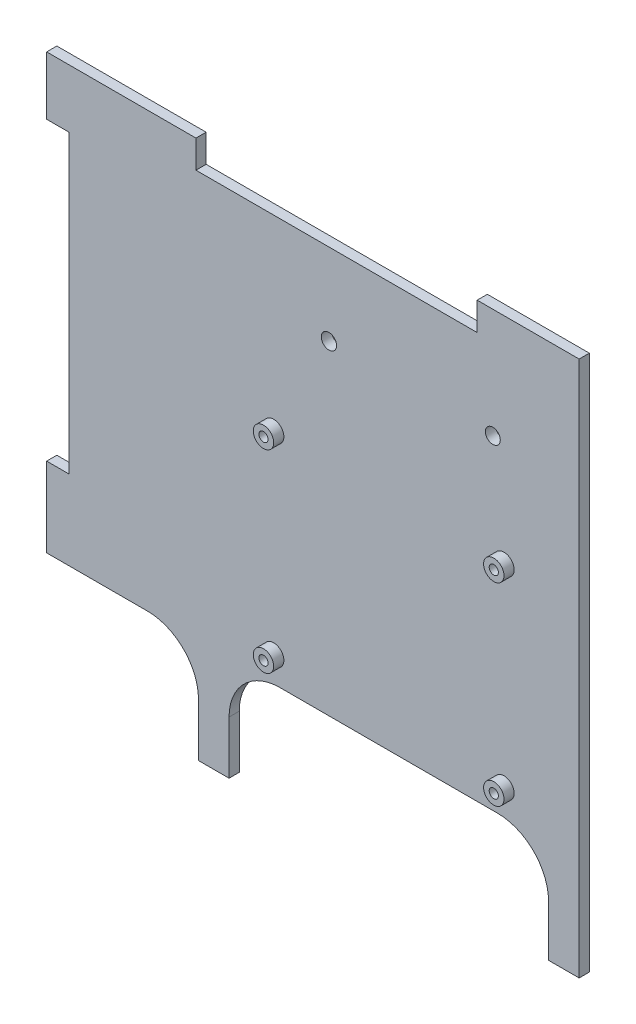
ISO-10303-21;
HEADER;
FILE_DESCRIPTION(('STEP AP214'),'2;1');
FILE_NAME('part.step','',(''),(''),'','','');
FILE_SCHEMA(('AUTOMOTIVE_DESIGN { 1 0 10303 214 1 1 1 1 }'));
ENDSEC;
DATA;
#1=APPLICATION_CONTEXT('core data for automotive mechanical design processes');
#2=APPLICATION_PROTOCOL_DEFINITION('international standard','automotive_design',2000,#1);
#3=PRODUCT_CONTEXT('',#1,'mechanical');
#4=PRODUCT('Part','Part','',(#3));
#5=PRODUCT_RELATED_PRODUCT_CATEGORY('part','',(#4));
#6=PRODUCT_DEFINITION_FORMATION('','',#4);
#7=PRODUCT_DEFINITION_CONTEXT('part definition',#1,'design');
#8=PRODUCT_DEFINITION('design','',#6,#7);
#9=PRODUCT_DEFINITION_SHAPE('','',#8);
#10=(LENGTH_UNIT() NAMED_UNIT(*) SI_UNIT(.MILLI.,.METRE.));
#11=(NAMED_UNIT(*) PLANE_ANGLE_UNIT() SI_UNIT($,.RADIAN.));
#12=(NAMED_UNIT(*) SI_UNIT($,.STERADIAN.) SOLID_ANGLE_UNIT());
#13=UNCERTAINTY_MEASURE_WITH_UNIT(LENGTH_MEASURE(1.E-05),#10,'distance_accuracy_value','');
#14=(GEOMETRIC_REPRESENTATION_CONTEXT(3) GLOBAL_UNCERTAINTY_ASSIGNED_CONTEXT((#13)) GLOBAL_UNIT_ASSIGNED_CONTEXT((#10,
#11,#12)) REPRESENTATION_CONTEXT('',''));
#15=CARTESIAN_POINT('',(0.,0.,0.));
#16=DIRECTION('',(0.,0.,1.));
#17=DIRECTION('',(1.,0.,0.));
#18=AXIS2_PLACEMENT_3D('',#15,#16,#17);
#19=CARTESIAN_POINT('',(12.708274755667,-91.0589998065809,2.54));
#20=DIRECTION('',(0.,1.,0.));
#21=DIRECTION('',(0.,0.,1.));
#22=AXIS2_PLACEMENT_3D('',#19,#20,#21);
#23=PLANE('',#22);
#24=DIRECTION('',(1.,0.,0.));
#25=VECTOR('',#24,1.);
#26=CARTESIAN_POINT('',(12.708274755667,-91.0589998065809,0.));
#27=LINE('',#26,#25);
#28=CARTESIAN_POINT('',(5.088274755667,-91.0589998065809,0.));
#29=VERTEX_POINT('',#28);
#30=CARTESIAN_POINT('',(12.708274755667,-91.0589998065809,0.));
#31=VERTEX_POINT('',#30);
#32=EDGE_CURVE('E213',#29,#31,#27,.T.);
#33=ORIENTED_EDGE('',*,*,#32,.T.);
#34=DIRECTION('',(0.,0.,-1.));
#35=VECTOR('',#34,1.);
#36=CARTESIAN_POINT('',(12.708274755667,-91.0589998065809,2.54));
#37=LINE('',#36,#35);
#38=CARTESIAN_POINT('',(12.708274755667,-91.0589998065809,2.54));
#39=VERTEX_POINT('',#38);
#40=EDGE_CURVE('E11',#39,#31,#37,.T.);
#41=ORIENTED_EDGE('',*,*,#40,.F.);
#42=DIRECTION('',(1.,0.,0.));
#43=VECTOR('',#42,1.);
#44=CARTESIAN_POINT('',(12.708274755667,-91.0589998065809,2.54));
#45=LINE('',#44,#43);
#46=CARTESIAN_POINT('',(5.088274755667,-91.0589998065809,2.54));
#47=VERTEX_POINT('',#46);
#48=EDGE_CURVE('E256',#47,#39,#45,.T.);
#49=ORIENTED_EDGE('',*,*,#48,.F.);
#50=DIRECTION('',(0.,0.,-1.));
#51=VECTOR('',#50,1.);
#52=CARTESIAN_POINT('',(5.088274755667,-91.0589998065809,2.54));
#53=LINE('',#52,#51);
#54=EDGE_CURVE('E209',#47,#29,#53,.T.);
#55=ORIENTED_EDGE('',*,*,#54,.T.);
#56=EDGE_LOOP('',(#33,#41,#49,#55));
#57=FACE_BOUND('',#56,.T.);
#58=ADVANCED_FACE('F39',(#57),#23,.F.);
#59=CARTESIAN_POINT('',(12.708274755667,42.5458464087125,2.54));
#60=DIRECTION('',(-1.,0.,0.));
#61=DIRECTION('',(0.,-1.,0.));
#62=AXIS2_PLACEMENT_3D('',#59,#60,#61);
#63=PLANE('',#62);
#64=DIRECTION('',(0.,1.,0.));
#65=VECTOR('',#64,1.);
#66=CARTESIAN_POINT('',(12.708274755667,42.5458464087125,0.));
#67=LINE('',#66,#65);
#68=CARTESIAN_POINT('',(12.708274755667,42.5458464087125,0.));
#69=VERTEX_POINT('',#68);
#70=EDGE_CURVE('E216',#31,#69,#67,.T.);
#71=ORIENTED_EDGE('',*,*,#70,.T.);
#72=DIRECTION('',(0.,0.,-1.));
#73=VECTOR('',#72,1.);
#74=CARTESIAN_POINT('',(12.708274755667,42.5458464087125,2.54));
#75=LINE('',#74,#73);
#76=CARTESIAN_POINT('',(12.708274755667,42.5458464087125,2.54));
#77=VERTEX_POINT('',#76);
#78=EDGE_CURVE('E47',#77,#69,#75,.T.);
#79=ORIENTED_EDGE('',*,*,#78,.F.);
#80=DIRECTION('',(0.,1.,0.));
#81=VECTOR('',#80,1.);
#82=CARTESIAN_POINT('',(12.708274755667,-33.1469998065807,2.54));
#83=LINE('',#82,#81);
#84=EDGE_CURVE('E137',#39,#77,#83,.T.);
#85=ORIENTED_EDGE('',*,*,#84,.F.);
#86=ORIENTED_EDGE('',*,*,#40,.T.);
#87=EDGE_LOOP('',(#71,#79,#85,#86));
#88=FACE_BOUND('',#87,.T.);
#89=ADVANCED_FACE('F379',(#88),#63,.F.);
#90=CARTESIAN_POINT('',(12.708274755667,42.5458464087125,2.54));
#91=DIRECTION('',(6.65955359009881E-05,-0.999999997782517,0.));
#92=DIRECTION('',(0.999999997782517,6.65955359009881E-05,0.));
#93=AXIS2_PLACEMENT_3D('',#90,#91,#92);
#94=PLANE('',#93);
#95=DIRECTION('',(-0.999999997782517,-6.65955359009881E-05,0.));
#96=VECTOR('',#95,1.);
#97=CARTESIAN_POINT('',(12.708274755667,42.5458464087125,0.));
#98=LINE('',#97,#96);
#99=CARTESIAN_POINT('',(-12.7139378821143,42.5441534028343,0.));
#100=VERTEX_POINT('',#99);
#101=EDGE_CURVE('E219',#69,#100,#98,.T.);
#102=ORIENTED_EDGE('',*,*,#101,.T.);
#103=DIRECTION('',(0.,0.,-1.));
#104=VECTOR('',#103,1.);
#105=CARTESIAN_POINT('',(-12.7139378821143,42.5441534028343,2.54));
#106=LINE('',#105,#104);
#107=CARTESIAN_POINT('',(-12.7139378821143,42.5441534028343,2.54));
#108=VERTEX_POINT('',#107);
#109=EDGE_CURVE('E302',#108,#100,#106,.T.);
#110=ORIENTED_EDGE('',*,*,#109,.F.);
#111=DIRECTION('',(-0.999999997782517,-6.65955359009881E-05,0.));
#112=VECTOR('',#111,1.);
#113=CARTESIAN_POINT('',(12.708274755667,42.5458464087125,2.54));
#114=LINE('',#113,#112);
#115=EDGE_CURVE('E310',#77,#108,#114,.T.);
#116=ORIENTED_EDGE('',*,*,#115,.F.);
#117=ORIENTED_EDGE('',*,*,#78,.T.);
#118=EDGE_LOOP('',(#102,#110,#116,#117));
#119=FACE_BOUND('',#118,.T.);
#120=ADVANCED_FACE('F308',(#119),#94,.F.);
#121=CARTESIAN_POINT('',(-12.7139378821143,42.5441534028343,2.54));
#122=DIRECTION('',(0.999999672458744,0.000809371611161022,0.));
#123=DIRECTION('',(-0.000809371611161022,0.999999672458744,0.));
#124=AXIS2_PLACEMENT_3D('',#121,#122,#123);
#125=PLANE('',#124);
#126=DIRECTION('',(0.000809371611161022,-0.999999672458744,0.));
#127=VECTOR('',#126,1.);
#128=CARTESIAN_POINT('',(-12.7139378821143,42.5441534028343,0.));
#129=LINE('',#128,#127);
#130=CARTESIAN_POINT('',(-12.7082789284205,35.5523689589811,0.));
#131=VERTEX_POINT('',#130);
#132=EDGE_CURVE('E221',#100,#131,#129,.T.);
#133=ORIENTED_EDGE('',*,*,#132,.T.);
#134=DIRECTION('',(0.,0.,-1.));
#135=VECTOR('',#134,1.);
#136=CARTESIAN_POINT('',(-12.7082789284205,35.5523689589811,2.54));
#137=LINE('',#136,#135);
#138=CARTESIAN_POINT('',(-12.7082789284205,35.5523689589811,2.54));
#139=VERTEX_POINT('',#138);
#140=EDGE_CURVE('E299',#139,#131,#137,.T.);
#141=ORIENTED_EDGE('',*,*,#140,.F.);
#142=DIRECTION('',(0.000809371611161022,-0.999999672458744,0.));
#143=VECTOR('',#142,1.);
#144=CARTESIAN_POINT('',(-12.7139378821143,42.5441534028343,2.54));
#145=LINE('',#144,#143);
#146=EDGE_CURVE('E328',#108,#139,#145,.T.);
#147=ORIENTED_EDGE('',*,*,#146,.F.);
#148=ORIENTED_EDGE('',*,*,#109,.T.);
#149=EDGE_LOOP('',(#133,#141,#147,#148));
#150=FACE_BOUND('',#149,.T.);
#151=ADVANCED_FACE('F319',(#150),#125,.F.);
#152=CARTESIAN_POINT('',(-82.8011936971982,35.5523689589811,2.54));
#153=DIRECTION('',(0.,-1.,0.));
#154=DIRECTION('',(1.,0.,0.));
#155=AXIS2_PLACEMENT_3D('',#152,#153,#154);
#156=PLANE('',#155);
#157=DIRECTION('',(-1.,0.,0.));
#158=VECTOR('',#157,1.);
#159=CARTESIAN_POINT('',(-82.8011936971982,35.5523689589811,0.));
#160=LINE('',#159,#158);
#161=CARTESIAN_POINT('',(-82.8011936971982,35.5523689589811,0.));
#162=VERTEX_POINT('',#161);
#163=EDGE_CURVE('E223',#131,#162,#160,.T.);
#164=ORIENTED_EDGE('',*,*,#163,.T.);
#165=DIRECTION('',(0.,0.,-1.));
#166=VECTOR('',#165,1.);
#167=CARTESIAN_POINT('',(-82.8011936971982,35.5523689589811,2.54));
#168=LINE('',#167,#166);
#169=CARTESIAN_POINT('',(-82.8011936971982,35.5523689589811,2.54));
#170=VERTEX_POINT('',#169);
#171=EDGE_CURVE('E296',#170,#162,#168,.T.);
#172=ORIENTED_EDGE('',*,*,#171,.F.);
#173=DIRECTION('',(-1.,0.,0.));
#174=VECTOR('',#173,1.);
#175=CARTESIAN_POINT('',(-82.8011936971982,35.5523689589811,2.54));
#176=LINE('',#175,#174);
#177=EDGE_CURVE('E325',#139,#170,#176,.T.);
#178=ORIENTED_EDGE('',*,*,#177,.F.);
#179=ORIENTED_EDGE('',*,*,#140,.T.);
#180=EDGE_LOOP('',(#164,#172,#178,#179));
#181=FACE_BOUND('',#180,.T.);
#182=ADVANCED_FACE('F323',(#181),#156,.F.);
#183=CARTESIAN_POINT('',(-82.8011936971982,35.5523689589811,2.54));
#184=DIRECTION('',(-0.999999671650771,-0.000810369267691798,0.));
#185=DIRECTION('',(0.000810369267691798,-0.999999671650771,0.));
#186=AXIS2_PLACEMENT_3D('',#183,#184,#185);
#187=PLANE('',#186);
#188=DIRECTION('',(-0.000810369267691798,0.999999671650771,0.));
#189=VECTOR('',#188,1.);
#190=CARTESIAN_POINT('',(-82.8011936971982,35.5523689589811,0.));
#191=LINE('',#190,#189);
#192=CARTESIAN_POINT('',(-82.8068104036919,42.4834124639083,0.));
#193=VERTEX_POINT('',#192);
#194=EDGE_CURVE('E225',#162,#193,#191,.T.);
#195=ORIENTED_EDGE('',*,*,#194,.T.);
#196=DIRECTION('',(0.,0.,-1.));
#197=VECTOR('',#196,1.);
#198=CARTESIAN_POINT('',(-82.8068104036919,42.4834124639083,2.54));
#199=LINE('',#198,#197);
#200=CARTESIAN_POINT('',(-82.8068104036919,42.4834124639083,2.54));
#201=VERTEX_POINT('',#200);
#202=EDGE_CURVE('E293',#201,#193,#199,.T.);
#203=ORIENTED_EDGE('',*,*,#202,.F.);
#204=DIRECTION('',(-0.000810369267691798,0.999999671650771,0.));
#205=VECTOR('',#204,1.);
#206=CARTESIAN_POINT('',(-82.8011936971982,35.5523689589811,2.54));
#207=LINE('',#206,#205);
#208=EDGE_CURVE('E327',#170,#201,#207,.T.);
#209=ORIENTED_EDGE('',*,*,#208,.F.);
#210=ORIENTED_EDGE('',*,*,#171,.T.);
#211=EDGE_LOOP('',(#195,#203,#209,#210));
#212=FACE_BOUND('',#211,.T.);
#213=ADVANCED_FACE('F392',(#212),#187,.F.);
#214=CARTESIAN_POINT('',(-120.015,42.4834124639083,2.54));
#215=DIRECTION('',(0.,-1.,0.));
#216=DIRECTION('',(0.,0.,-1.));
#217=AXIS2_PLACEMENT_3D('',#214,#215,#216);
#218=PLANE('',#217);
#219=DIRECTION('',(-1.,0.,0.));
#220=VECTOR('',#219,1.);
#221=CARTESIAN_POINT('',(-120.015,42.4834124639083,0.));
#222=LINE('',#221,#220);
#223=CARTESIAN_POINT('',(-120.015,42.4834124639083,0.));
#224=VERTEX_POINT('',#223);
#225=EDGE_CURVE('E227',#193,#224,#222,.T.);
#226=ORIENTED_EDGE('',*,*,#225,.T.);
#227=DIRECTION('',(0.,0.,-1.));
#228=VECTOR('',#227,1.);
#229=CARTESIAN_POINT('',(-120.015,42.4834124639083,2.54));
#230=LINE('',#229,#228);
#231=CARTESIAN_POINT('',(-120.015,42.4834124639083,2.54));
#232=VERTEX_POINT('',#231);
#233=EDGE_CURVE('E290',#232,#224,#230,.T.);
#234=ORIENTED_EDGE('',*,*,#233,.F.);
#235=DIRECTION('',(-1.,0.,0.));
#236=VECTOR('',#235,1.);
#237=CARTESIAN_POINT('',(-120.015,42.4834124639083,2.54));
#238=LINE('',#237,#236);
#239=EDGE_CURVE('E330',#201,#232,#238,.T.);
#240=ORIENTED_EDGE('',*,*,#239,.F.);
#241=ORIENTED_EDGE('',*,*,#202,.T.);
#242=EDGE_LOOP('',(#226,#234,#240,#241));
#243=FACE_BOUND('',#242,.T.);
#244=ADVANCED_FACE('F395',(#243),#218,.F.);
#245=CARTESIAN_POINT('',(-120.015,27.9323689589811,2.54));
#246=DIRECTION('',(1.,0.,0.));
#247=DIRECTION('',(0.,0.,-1.));
#248=AXIS2_PLACEMENT_3D('',#245,#246,#247);
#249=PLANE('',#248);
#250=DIRECTION('',(0.,-1.,0.));
#251=VECTOR('',#250,1.);
#252=CARTESIAN_POINT('',(-120.015,27.9323689589811,0.));
#253=LINE('',#252,#251);
#254=CARTESIAN_POINT('',(-120.015,27.9323689589811,0.));
#255=VERTEX_POINT('',#254);
#256=EDGE_CURVE('E229',#224,#255,#253,.T.);
#257=ORIENTED_EDGE('',*,*,#256,.T.);
#258=DIRECTION('',(0.,0.,-1.));
#259=VECTOR('',#258,1.);
#260=CARTESIAN_POINT('',(-120.015,27.9323689589811,2.54));
#261=LINE('',#260,#259);
#262=CARTESIAN_POINT('',(-120.015,27.9323689589811,2.54));
#263=VERTEX_POINT('',#262);
#264=EDGE_CURVE('E287',#263,#255,#261,.T.);
#265=ORIENTED_EDGE('',*,*,#264,.F.);
#266=DIRECTION('',(0.,-1.,0.));
#267=VECTOR('',#266,1.);
#268=CARTESIAN_POINT('',(-120.015,27.9323689589811,2.54));
#269=LINE('',#268,#267);
#270=EDGE_CURVE('E336',#232,#263,#269,.T.);
#271=ORIENTED_EDGE('',*,*,#270,.F.);
#272=ORIENTED_EDGE('',*,*,#233,.T.);
#273=EDGE_LOOP('',(#257,#265,#271,#272));
#274=FACE_BOUND('',#273,.T.);
#275=ADVANCED_FACE('F399',(#274),#249,.F.);
#276=CARTESIAN_POINT('',(-114.427,27.9323689589811,2.54));
#277=DIRECTION('',(0.,1.,0.));
#278=DIRECTION('',(0.,0.,1.));
#279=AXIS2_PLACEMENT_3D('',#276,#277,#278);
#280=PLANE('',#279);
#281=DIRECTION('',(1.,0.,0.));
#282=VECTOR('',#281,1.);
#283=CARTESIAN_POINT('',(-114.427,27.9323689589811,0.));
#284=LINE('',#283,#282);
#285=CARTESIAN_POINT('',(-114.427,27.9323689589811,0.));
#286=VERTEX_POINT('',#285);
#287=EDGE_CURVE('E231',#255,#286,#284,.T.);
#288=ORIENTED_EDGE('',*,*,#287,.T.);
#289=DIRECTION('',(0.,0.,-1.));
#290=VECTOR('',#289,1.);
#291=CARTESIAN_POINT('',(-114.427,27.9323689589811,2.54));
#292=LINE('',#291,#290);
#293=CARTESIAN_POINT('',(-114.427,27.9323689589811,2.54));
#294=VERTEX_POINT('',#293);
#295=EDGE_CURVE('E284',#294,#286,#292,.T.);
#296=ORIENTED_EDGE('',*,*,#295,.F.);
#297=DIRECTION('',(1.,0.,0.));
#298=VECTOR('',#297,1.);
#299=CARTESIAN_POINT('',(-114.427,27.9323689589811,2.54));
#300=LINE('',#299,#298);
#301=EDGE_CURVE('E338',#263,#294,#300,.T.);
#302=ORIENTED_EDGE('',*,*,#301,.F.);
#303=ORIENTED_EDGE('',*,*,#264,.T.);
#304=EDGE_LOOP('',(#288,#296,#302,#303));
#305=FACE_BOUND('',#304,.T.);
#306=ADVANCED_FACE('F403',(#305),#280,.F.);
#307=CARTESIAN_POINT('',(-114.427,27.9323689589811,2.54));
#308=DIRECTION('',(1.,0.,0.));
#309=DIRECTION('',(0.,0.,-1.));
#310=AXIS2_PLACEMENT_3D('',#307,#308,#309);
#311=PLANE('',#310);
#312=DIRECTION('',(0.,-1.,0.));
#313=VECTOR('',#312,1.);
#314=CARTESIAN_POINT('',(-114.427,27.9323689589811,0.));
#315=LINE('',#314,#313);
#316=CARTESIAN_POINT('',(-114.427,-45.8469998065808,0.));
#317=VERTEX_POINT('',#316);
#318=EDGE_CURVE('E233',#286,#317,#315,.T.);
#319=ORIENTED_EDGE('',*,*,#318,.T.);
#320=DIRECTION('',(0.,0.,-1.));
#321=VECTOR('',#320,1.);
#322=CARTESIAN_POINT('',(-114.427,-45.8469998065808,2.54));
#323=LINE('',#322,#321);
#324=CARTESIAN_POINT('',(-114.427,-45.8469998065808,2.54));
#325=VERTEX_POINT('',#324);
#326=EDGE_CURVE('E281',#325,#317,#323,.T.);
#327=ORIENTED_EDGE('',*,*,#326,.F.);
#328=DIRECTION('',(0.,-1.,0.));
#329=VECTOR('',#328,1.);
#330=CARTESIAN_POINT('',(-114.427,27.9323689589811,2.54));
#331=LINE('',#330,#329);
#332=EDGE_CURVE('E340',#294,#325,#331,.T.);
#333=ORIENTED_EDGE('',*,*,#332,.F.);
#334=ORIENTED_EDGE('',*,*,#295,.T.);
#335=EDGE_LOOP('',(#319,#327,#333,#334));
#336=FACE_BOUND('',#335,.T.);
#337=ADVANCED_FACE('F407',(#336),#311,.F.);
#338=CARTESIAN_POINT('',(-114.427,-45.8469998065808,2.54));
#339=DIRECTION('',(0.,-1.,0.));
#340=DIRECTION('',(0.,0.,-1.));
#341=AXIS2_PLACEMENT_3D('',#338,#339,#340);
#342=PLANE('',#341);
#343=DIRECTION('',(-1.,0.,0.));
#344=VECTOR('',#343,1.);
#345=CARTESIAN_POINT('',(-114.427,-45.8469998065808,0.));
#346=LINE('',#345,#344);
#347=CARTESIAN_POINT('',(-120.015,-45.8469998065808,0.));
#348=VERTEX_POINT('',#347);
#349=EDGE_CURVE('E235',#317,#348,#346,.T.);
#350=ORIENTED_EDGE('',*,*,#349,.T.);
#351=DIRECTION('',(0.,0.,-1.));
#352=VECTOR('',#351,1.);
#353=CARTESIAN_POINT('',(-120.015,-45.8469998065808,2.54));
#354=LINE('',#353,#352);
#355=CARTESIAN_POINT('',(-120.015,-45.8469998065808,2.54));
#356=VERTEX_POINT('',#355);
#357=EDGE_CURVE('E278',#356,#348,#354,.T.);
#358=ORIENTED_EDGE('',*,*,#357,.F.);
#359=DIRECTION('',(-1.,0.,0.));
#360=VECTOR('',#359,1.);
#361=CARTESIAN_POINT('',(-114.427,-45.8469998065808,2.54));
#362=LINE('',#361,#360);
#363=EDGE_CURVE('E342',#325,#356,#362,.T.);
#364=ORIENTED_EDGE('',*,*,#363,.F.);
#365=ORIENTED_EDGE('',*,*,#326,.T.);
#366=EDGE_LOOP('',(#350,#358,#364,#365));
#367=FACE_BOUND('',#366,.T.);
#368=ADVANCED_FACE('F411',(#367),#342,.F.);
#369=CARTESIAN_POINT('',(-120.015,-45.8469998065808,2.54));
#370=DIRECTION('',(1.,0.,0.));
#371=DIRECTION('',(0.,0.,-1.));
#372=AXIS2_PLACEMENT_3D('',#369,#370,#371);
#373=PLANE('',#372);
#374=DIRECTION('',(0.,-1.,0.));
#375=VECTOR('',#374,1.);
#376=CARTESIAN_POINT('',(-120.015,-45.8469998065808,0.));
#377=LINE('',#376,#375);
#378=CARTESIAN_POINT('',(-120.015,-65.6589998065809,0.));
#379=VERTEX_POINT('',#378);
#380=EDGE_CURVE('E237',#348,#379,#377,.T.);
#381=ORIENTED_EDGE('',*,*,#380,.T.);
#382=DIRECTION('',(0.,0.,-1.));
#383=VECTOR('',#382,1.);
#384=CARTESIAN_POINT('',(-120.015,-65.6589998065809,2.54));
#385=LINE('',#384,#383);
#386=CARTESIAN_POINT('',(-120.015,-65.6589998065809,2.54));
#387=VERTEX_POINT('',#386);
#388=EDGE_CURVE('E275',#387,#379,#385,.T.);
#389=ORIENTED_EDGE('',*,*,#388,.F.);
#390=DIRECTION('',(0.,-1.,0.));
#391=VECTOR('',#390,1.);
#392=CARTESIAN_POINT('',(-120.015,-45.8469998065808,2.54));
#393=LINE('',#392,#391);
#394=EDGE_CURVE('E344',#356,#387,#393,.T.);
#395=ORIENTED_EDGE('',*,*,#394,.F.);
#396=ORIENTED_EDGE('',*,*,#357,.T.);
#397=EDGE_LOOP('',(#381,#389,#395,#396));
#398=FACE_BOUND('',#397,.T.);
#399=ADVANCED_FACE('F415',(#398),#373,.F.);
#400=CARTESIAN_POINT('',(-120.015,-65.6589998065809,2.54));
#401=DIRECTION('',(0.,1.,0.));
#402=DIRECTION('',(0.,0.,1.));
#403=AXIS2_PLACEMENT_3D('',#400,#401,#402);
#404=PLANE('',#403);
#405=DIRECTION('',(1.,0.,0.));
#406=VECTOR('',#405,1.);
#407=CARTESIAN_POINT('',(-120.015,-65.6589998065809,0.));
#408=LINE('',#407,#406);
#409=CARTESIAN_POINT('',(-94.869,-65.6589998065809,0.));
#410=VERTEX_POINT('',#409);
#411=EDGE_CURVE('E239',#379,#410,#408,.T.);
#412=ORIENTED_EDGE('',*,*,#411,.T.);
#413=DIRECTION('',(0.,0.,-1.));
#414=VECTOR('',#413,1.);
#415=CARTESIAN_POINT('',(-94.869,-65.6589998065809,2.54));
#416=LINE('',#415,#414);
#417=CARTESIAN_POINT('',(-94.869,-65.6589998065809,2.54));
#418=VERTEX_POINT('',#417);
#419=EDGE_CURVE('E272',#418,#410,#416,.T.);
#420=ORIENTED_EDGE('',*,*,#419,.F.);
#421=DIRECTION('',(1.,0.,0.));
#422=VECTOR('',#421,1.);
#423=CARTESIAN_POINT('',(-120.015,-65.6589998065809,2.54));
#424=LINE('',#423,#422);
#425=EDGE_CURVE('E346',#387,#418,#424,.T.);
#426=ORIENTED_EDGE('',*,*,#425,.F.);
#427=ORIENTED_EDGE('',*,*,#388,.T.);
#428=EDGE_LOOP('',(#412,#420,#426,#427));
#429=FACE_BOUND('',#428,.T.);
#430=ADVANCED_FACE('F419',(#429),#404,.F.);
#431=CARTESIAN_POINT('',(-94.869,-78.3589998065809,2.54));
#432=DIRECTION('',(0.,0.,-1.));
#433=DIRECTION('',(-1.,0.,0.));
#434=AXIS2_PLACEMENT_3D('',#431,#432,#433);
#435=CYLINDRICAL_SURFACE('',#434,12.7);
#436=CARTESIAN_POINT('',(-94.869,-78.3589998065809,0.));
#437=DIRECTION('',(0.,0.,-1.));
#438=DIRECTION('',(1.,0.,0.));
#439=AXIS2_PLACEMENT_3D('',#436,#437,#438);
#440=CIRCLE('',#439,12.7);
#441=CARTESIAN_POINT('',(-82.169,-78.3589998065809,0.));
#442=VERTEX_POINT('',#441);
#443=EDGE_CURVE('E241',#410,#442,#440,.T.);
#444=ORIENTED_EDGE('',*,*,#443,.T.);
#445=DIRECTION('',(0.,0.,-1.));
#446=VECTOR('',#445,1.);
#447=CARTESIAN_POINT('',(-82.169,-78.3589998065809,2.54));
#448=LINE('',#447,#446);
#449=CARTESIAN_POINT('',(-82.169,-78.3589998065809,2.54));
#450=VERTEX_POINT('',#449);
#451=EDGE_CURVE('E269',#450,#442,#448,.T.);
#452=ORIENTED_EDGE('',*,*,#451,.F.);
#453=CARTESIAN_POINT('',(-94.869,-78.3589998065809,2.54));
#454=DIRECTION('',(0.,0.,-1.));
#455=DIRECTION('',(1.,0.,0.));
#456=AXIS2_PLACEMENT_3D('',#453,#454,#455);
#457=CIRCLE('',#456,12.7);
#458=EDGE_CURVE('E348',#418,#450,#457,.T.);
#459=ORIENTED_EDGE('',*,*,#458,.F.);
#460=ORIENTED_EDGE('',*,*,#419,.T.);
#461=EDGE_LOOP('',(#444,#452,#459,#460));
#462=FACE_BOUND('',#461,.T.);
#463=ADVANCED_FACE('F423',(#462),#435,.F.);
#464=CARTESIAN_POINT('',(-82.169,-91.5669998065809,2.54));
#465=DIRECTION('',(1.,0.,0.));
#466=DIRECTION('',(0.,0.,-1.));
#467=AXIS2_PLACEMENT_3D('',#464,#465,#466);
#468=PLANE('',#467);
#469=DIRECTION('',(0.,-1.,0.));
#470=VECTOR('',#469,1.);
#471=CARTESIAN_POINT('',(-82.169,-91.5669998065809,0.));
#472=LINE('',#471,#470);
#473=CARTESIAN_POINT('',(-82.169,-91.5669998065809,0.));
#474=VERTEX_POINT('',#473);
#475=EDGE_CURVE('E244',#442,#474,#472,.T.);
#476=ORIENTED_EDGE('',*,*,#475,.T.);
#477=DIRECTION('',(0.,0.,-1.));
#478=VECTOR('',#477,1.);
#479=CARTESIAN_POINT('',(-82.169,-91.5669998065809,2.54));
#480=LINE('',#479,#478);
#481=CARTESIAN_POINT('',(-82.169,-91.5669998065809,2.54));
#482=VERTEX_POINT('',#481);
#483=EDGE_CURVE('E266',#482,#474,#480,.T.);
#484=ORIENTED_EDGE('',*,*,#483,.F.);
#485=DIRECTION('',(0.,-1.,0.));
#486=VECTOR('',#485,1.);
#487=CARTESIAN_POINT('',(-82.169,-85.7249998065809,2.54));
#488=LINE('',#487,#486);
#489=EDGE_CURVE('E350',#450,#482,#488,.T.);
#490=ORIENTED_EDGE('',*,*,#489,.F.);
#491=ORIENTED_EDGE('',*,*,#451,.T.);
#492=EDGE_LOOP('',(#476,#484,#490,#491));
#493=FACE_BOUND('',#492,.T.);
#494=ADVANCED_FACE('F427',(#493),#468,.F.);
#495=CARTESIAN_POINT('',(-82.169,-91.5669998065809,2.54));
#496=DIRECTION('',(0.,1.,0.));
#497=DIRECTION('',(0.,0.,1.));
#498=AXIS2_PLACEMENT_3D('',#495,#496,#497);
#499=PLANE('',#498);
#500=DIRECTION('',(1.,0.,0.));
#501=VECTOR('',#500,1.);
#502=CARTESIAN_POINT('',(-82.169,-91.5669998065809,0.));
#503=LINE('',#502,#501);
#504=CARTESIAN_POINT('',(-74.549,-91.5669998065809,0.));
#505=VERTEX_POINT('',#504);
#506=EDGE_CURVE('E246',#474,#505,#503,.T.);
#507=ORIENTED_EDGE('',*,*,#506,.T.);
#508=DIRECTION('',(0.,0.,-1.));
#509=VECTOR('',#508,1.);
#510=CARTESIAN_POINT('',(-74.549,-91.5669998065809,2.54));
#511=LINE('',#510,#509);
#512=CARTESIAN_POINT('',(-74.549,-91.5669998065809,2.54));
#513=VERTEX_POINT('',#512);
#514=EDGE_CURVE('E263',#513,#505,#511,.T.);
#515=ORIENTED_EDGE('',*,*,#514,.F.);
#516=DIRECTION('',(1.,0.,0.));
#517=VECTOR('',#516,1.);
#518=CARTESIAN_POINT('',(-82.169,-91.5669998065809,2.54));
#519=LINE('',#518,#517);
#520=EDGE_CURVE('E352',#482,#513,#519,.T.);
#521=ORIENTED_EDGE('',*,*,#520,.F.);
#522=ORIENTED_EDGE('',*,*,#483,.T.);
#523=EDGE_LOOP('',(#507,#515,#521,#522));
#524=FACE_BOUND('',#523,.T.);
#525=ADVANCED_FACE('F431',(#524),#499,.F.);
#526=CARTESIAN_POINT('',(-74.549,-85.7249998065809,2.54));
#527=DIRECTION('',(-1.,0.,0.));
#528=DIRECTION('',(0.,0.,1.));
#529=AXIS2_PLACEMENT_3D('',#526,#527,#528);
#530=PLANE('',#529);
#531=DIRECTION('',(0.,1.,0.));
#532=VECTOR('',#531,1.);
#533=CARTESIAN_POINT('',(-74.549,-85.7249998065809,0.));
#534=LINE('',#533,#532);
#535=CARTESIAN_POINT('',(-74.549,-78.3589998065809,0.));
#536=VERTEX_POINT('',#535);
#537=EDGE_CURVE('E249',#505,#536,#534,.T.);
#538=ORIENTED_EDGE('',*,*,#537,.T.);
#539=DIRECTION('',(0.,0.,-1.));
#540=VECTOR('',#539,1.);
#541=CARTESIAN_POINT('',(-74.549,-78.3589998065809,2.54));
#542=LINE('',#541,#540);
#543=CARTESIAN_POINT('',(-74.549,-78.3589998065809,2.54));
#544=VERTEX_POINT('',#543);
#545=EDGE_CURVE('E260',#544,#536,#542,.T.);
#546=ORIENTED_EDGE('',*,*,#545,.F.);
#547=DIRECTION('',(0.,1.,0.));
#548=VECTOR('',#547,1.);
#549=CARTESIAN_POINT('',(-74.549,-91.5669998065809,2.54));
#550=LINE('',#549,#548);
#551=EDGE_CURVE('E354',#513,#544,#550,.T.);
#552=ORIENTED_EDGE('',*,*,#551,.F.);
#553=ORIENTED_EDGE('',*,*,#514,.T.);
#554=EDGE_LOOP('',(#538,#546,#552,#553));
#555=FACE_BOUND('',#554,.T.);
#556=ADVANCED_FACE('F360',(#555),#530,.F.);
#557=CARTESIAN_POINT('',(-61.849,-78.3589998065809,2.54));
#558=DIRECTION('',(0.,0.,-1.));
#559=DIRECTION('',(-1.,0.,0.));
#560=AXIS2_PLACEMENT_3D('',#557,#558,#559);
#561=CYLINDRICAL_SURFACE('',#560,12.7);
#562=CARTESIAN_POINT('',(-61.849,-78.3589998065809,0.));
#563=DIRECTION('',(0.,0.,-1.));
#564=DIRECTION('',(-1.,0.,0.));
#565=AXIS2_PLACEMENT_3D('',#562,#563,#564);
#566=CIRCLE('',#565,12.7);
#567=CARTESIAN_POINT('',(-61.8489999999999,-65.6589998065809,0.));
#568=VERTEX_POINT('',#567);
#569=EDGE_CURVE('E251',#536,#568,#566,.T.);
#570=ORIENTED_EDGE('',*,*,#569,.T.);
#571=DIRECTION('',(0.,0.,-1.));
#572=VECTOR('',#571,1.);
#573=CARTESIAN_POINT('',(-61.8489999999999,-65.6589998065809,2.54));
#574=LINE('',#573,#572);
#575=CARTESIAN_POINT('',(-61.8489999999999,-65.6589998065809,2.54));
#576=VERTEX_POINT('',#575);
#577=EDGE_CURVE('E204',#576,#568,#574,.T.);
#578=ORIENTED_EDGE('',*,*,#577,.F.);
#579=CARTESIAN_POINT('',(-61.849,-78.3589998065809,2.54));
#580=DIRECTION('',(0.,0.,-1.));
#581=DIRECTION('',(-1.,0.,0.));
#582=AXIS2_PLACEMENT_3D('',#579,#580,#581);
#583=CIRCLE('',#582,12.7);
#584=EDGE_CURVE('E195',#544,#576,#583,.T.);
#585=ORIENTED_EDGE('',*,*,#584,.F.);
#586=ORIENTED_EDGE('',*,*,#545,.T.);
#587=EDGE_LOOP('',(#570,#578,#585,#586));
#588=FACE_BOUND('',#587,.T.);
#589=ADVANCED_FACE('F363',(#588),#561,.F.);
#590=CARTESIAN_POINT('',(-7.611725244333,-65.6589998065809,2.54));
#591=DIRECTION('',(0.,1.,0.));
#592=DIRECTION('',(0.,0.,1.));
#593=AXIS2_PLACEMENT_3D('',#590,#591,#592);
#594=PLANE('',#593);
#595=DIRECTION('',(1.,0.,0.));
#596=VECTOR('',#595,1.);
#597=CARTESIAN_POINT('',(-7.611725244333,-65.6589998065809,0.));
#598=LINE('',#597,#596);
#599=CARTESIAN_POINT('',(-7.611725244333,-65.6589998065809,0.));
#600=VERTEX_POINT('',#599);
#601=EDGE_CURVE('E203',#568,#600,#598,.T.);
#602=ORIENTED_EDGE('',*,*,#601,.T.);
#603=DIRECTION('',(0.,0.,-1.));
#604=VECTOR('',#603,1.);
#605=CARTESIAN_POINT('',(-7.611725244333,-65.6589998065809,2.54));
#606=LINE('',#605,#604);
#607=CARTESIAN_POINT('',(-7.611725244333,-65.6589998065809,2.54));
#608=VERTEX_POINT('',#607);
#609=EDGE_CURVE('E200',#608,#600,#606,.T.);
#610=ORIENTED_EDGE('',*,*,#609,.F.);
#611=DIRECTION('',(1.,0.,0.));
#612=VECTOR('',#611,1.);
#613=CARTESIAN_POINT('',(-7.611725244333,-65.6589998065809,2.54));
#614=LINE('',#613,#612);
#615=EDGE_CURVE('E189',#576,#608,#614,.T.);
#616=ORIENTED_EDGE('',*,*,#615,.F.);
#617=ORIENTED_EDGE('',*,*,#577,.T.);
#618=EDGE_LOOP('',(#602,#610,#616,#617));
#619=FACE_BOUND('',#618,.T.);
#620=ADVANCED_FACE('F201',(#619),#594,.F.);
#621=CARTESIAN_POINT('',(-7.611725244333,-78.3589998065809,2.54));
#622=DIRECTION('',(0.,0.,-1.));
#623=DIRECTION('',(-1.,0.,0.));
#624=AXIS2_PLACEMENT_3D('',#621,#622,#623);
#625=CYLINDRICAL_SURFACE('',#624,12.7);
#626=CARTESIAN_POINT('',(-7.611725244333,-78.3589998065809,0.));
#627=DIRECTION('',(0.,0.,-1.));
#628=DIRECTION('',(1.,0.,0.));
#629=AXIS2_PLACEMENT_3D('',#626,#627,#628);
#630=CIRCLE('',#629,12.7);
#631=CARTESIAN_POINT('',(5.08827475566701,-78.3589998065809,0.));
#632=VERTEX_POINT('',#631);
#633=EDGE_CURVE('E123',#600,#632,#630,.T.);
#634=ORIENTED_EDGE('',*,*,#633,.T.);
#635=DIRECTION('',(0.,0.,-1.));
#636=VECTOR('',#635,1.);
#637=CARTESIAN_POINT('',(5.08827475566701,-78.3589998065809,2.54));
#638=LINE('',#637,#636);
#639=CARTESIAN_POINT('',(5.08827475566701,-78.3589998065809,2.54));
#640=VERTEX_POINT('',#639);
#641=EDGE_CURVE('E205',#640,#632,#638,.T.);
#642=ORIENTED_EDGE('',*,*,#641,.F.);
#643=CARTESIAN_POINT('',(-7.611725244333,-78.3589998065809,2.54));
#644=DIRECTION('',(0.,0.,-1.));
#645=DIRECTION('',(1.,0.,0.));
#646=AXIS2_PLACEMENT_3D('',#643,#644,#645);
#647=CIRCLE('',#646,12.7);
#648=EDGE_CURVE('E193',#608,#640,#647,.T.);
#649=ORIENTED_EDGE('',*,*,#648,.F.);
#650=ORIENTED_EDGE('',*,*,#609,.T.);
#651=EDGE_LOOP('',(#634,#642,#649,#650));
#652=FACE_BOUND('',#651,.T.);
#653=ADVANCED_FACE('F207',(#652),#625,.F.);
#654=CARTESIAN_POINT('',(5.088274755667,-91.0589998065809,2.54));
#655=DIRECTION('',(1.,0.,0.));
#656=DIRECTION('',(0.,0.,-1.));
#657=AXIS2_PLACEMENT_3D('',#654,#655,#656);
#658=PLANE('',#657);
#659=DIRECTION('',(0.,-1.,0.));
#660=VECTOR('',#659,1.);
#661=CARTESIAN_POINT('',(5.088274755667,-91.0589998065809,0.));
#662=LINE('',#661,#660);
#663=EDGE_CURVE('E129',#632,#29,#662,.T.);
#664=ORIENTED_EDGE('',*,*,#663,.T.);
#665=ORIENTED_EDGE('',*,*,#54,.F.);
#666=DIRECTION('',(0.,-1.,0.));
#667=VECTOR('',#666,1.);
#668=CARTESIAN_POINT('',(5.088274755667,-91.0589998065809,2.54));
#669=LINE('',#668,#667);
#670=EDGE_CURVE('E55',#640,#47,#669,.T.);
#671=ORIENTED_EDGE('',*,*,#670,.F.);
#672=ORIENTED_EDGE('',*,*,#641,.T.);
#673=EDGE_LOOP('',(#664,#665,#671,#672));
#674=FACE_BOUND('',#673,.T.);
#675=ADVANCED_FACE('F367',(#674),#658,.F.);
#676=CARTESIAN_POINT('',(-7.611725244333,-78.3589998065809,2.54));
#677=DIRECTION('',(0.,0.,1.));
#678=DIRECTION('',(1.,0.,0.));
#679=AXIS2_PLACEMENT_3D('',#676,#677,#678);
#680=PLANE('',#679);
#681=CARTESIAN_POINT('',(-8.81192758878317,15.2092694757002,2.54));
#682=DIRECTION('',(0.,0.,1.));
#683=DIRECTION('',(1.,0.,0.));
#684=AXIS2_PLACEMENT_3D('',#681,#682,#683);
#685=CIRCLE('',#684,1.85880872402619);
#686=CARTESIAN_POINT('',(-6.95311886475698,15.2092694757002,2.54));
#687=VERTEX_POINT('',#686);
#688=EDGE_CURVE('E804',#687,#687,#685,.T.);
#689=ORIENTED_EDGE('',*,*,#688,.F.);
#690=EDGE_LOOP('',(#689));
#691=FACE_BOUND('',#690,.T.);
#692=CARTESIAN_POINT('',(-49.6609676805688,15.2092694757002,2.54));
#693=DIRECTION('',(0.,0.,1.));
#694=DIRECTION('',(1.,0.,0.));
#695=AXIS2_PLACEMENT_3D('',#692,#693,#694);
#696=CIRCLE('',#695,1.90623136775946);
#697=CARTESIAN_POINT('',(-47.7547363128094,15.2092694757002,2.54));
#698=VERTEX_POINT('',#697);
#699=EDGE_CURVE('E805',#698,#698,#696,.T.);
#700=ORIENTED_EDGE('',*,*,#699,.F.);
#701=EDGE_LOOP('',(#700));
#702=FACE_BOUND('',#701,.T.);
#703=CARTESIAN_POINT('',(-63.4323626221664,-11.0489998065808,2.54));
#704=DIRECTION('',(0.,0.,1.));
#705=DIRECTION('',(1.,0.,0.));
#706=AXIS2_PLACEMENT_3D('',#703,#704,#705);
#707=CIRCLE('',#706,2.54);
#708=CARTESIAN_POINT('',(-60.8923626221664,-11.0489998065808,2.54));
#709=VERTEX_POINT('',#708);
#710=EDGE_CURVE('E839',#709,#709,#707,.T.);
#711=ORIENTED_EDGE('',*,*,#710,.F.);
#712=EDGE_LOOP('',(#711));
#713=FACE_BOUND('',#712,.T.);
#714=CARTESIAN_POINT('',(-6.02836262216645,-11.0489998065808,2.54));
#715=DIRECTION('',(0.,0.,1.));
#716=DIRECTION('',(1.,0.,0.));
#717=AXIS2_PLACEMENT_3D('',#714,#715,#716);
#718=CIRCLE('',#717,2.54);
#719=CARTESIAN_POINT('',(-3.48836262216645,-11.0489998065808,2.54));
#720=VERTEX_POINT('',#719);
#721=EDGE_CURVE('E845',#720,#720,#718,.T.);
#722=ORIENTED_EDGE('',*,*,#721,.F.);
#723=EDGE_LOOP('',(#722));
#724=FACE_BOUND('',#723,.T.);
#725=CARTESIAN_POINT('',(-6.02836262216645,-59.3089998065809,2.54));
#726=DIRECTION('',(0.,0.,1.));
#727=DIRECTION('',(1.,0.,0.));
#728=AXIS2_PLACEMENT_3D('',#725,#726,#727);
#729=CIRCLE('',#728,2.54);
#730=CARTESIAN_POINT('',(-3.48836262216645,-59.3089998065809,2.54));
#731=VERTEX_POINT('',#730);
#732=EDGE_CURVE('E851',#731,#731,#729,.T.);
#733=ORIENTED_EDGE('',*,*,#732,.F.);
#734=EDGE_LOOP('',(#733));
#735=FACE_BOUND('',#734,.T.);
#736=CARTESIAN_POINT('',(-63.4323626221665,-59.3089998065809,2.54));
#737=DIRECTION('',(0.,0.,1.));
#738=DIRECTION('',(1.,0.,0.));
#739=AXIS2_PLACEMENT_3D('',#736,#737,#738);
#740=CIRCLE('',#739,2.54);
#741=CARTESIAN_POINT('',(-60.8923626221665,-59.3089998065809,2.54));
#742=VERTEX_POINT('',#741);
#743=EDGE_CURVE('E854',#742,#742,#740,.T.);
#744=ORIENTED_EDGE('',*,*,#743,.F.);
#745=EDGE_LOOP('',(#744));
#746=FACE_BOUND('',#745,.T.);
#747=ORIENTED_EDGE('',*,*,#48,.T.);
#748=ORIENTED_EDGE('',*,*,#84,.T.);
#749=ORIENTED_EDGE('',*,*,#115,.T.);
#750=ORIENTED_EDGE('',*,*,#146,.T.);
#751=ORIENTED_EDGE('',*,*,#177,.T.);
#752=ORIENTED_EDGE('',*,*,#208,.T.);
#753=ORIENTED_EDGE('',*,*,#239,.T.);
#754=ORIENTED_EDGE('',*,*,#270,.T.);
#755=ORIENTED_EDGE('',*,*,#301,.T.);
#756=ORIENTED_EDGE('',*,*,#332,.T.);
#757=ORIENTED_EDGE('',*,*,#363,.T.);
#758=ORIENTED_EDGE('',*,*,#394,.T.);
#759=ORIENTED_EDGE('',*,*,#425,.T.);
#760=ORIENTED_EDGE('',*,*,#458,.T.);
#761=ORIENTED_EDGE('',*,*,#489,.T.);
#762=ORIENTED_EDGE('',*,*,#520,.T.);
#763=ORIENTED_EDGE('',*,*,#551,.T.);
#764=ORIENTED_EDGE('',*,*,#584,.T.);
#765=ORIENTED_EDGE('',*,*,#615,.T.);
#766=ORIENTED_EDGE('',*,*,#648,.T.);
#767=ORIENTED_EDGE('',*,*,#670,.T.);
#768=EDGE_LOOP('',(#747,#748,#749,#750,#751,#752,#753,#754,#755,#756,#757,#758,#759,#760,#761,
#762,#763,#764,#765,#766,#767));
#769=FACE_BOUND('',#768,.T.);
#770=ADVANCED_FACE('F191',(#691,#702,#713,#724,#735,#746,#769),#680,.T.);
#771=CARTESIAN_POINT('',(-7.611725244333,-78.3589998065809,0.));
#772=DIRECTION('',(0.,0.,1.));
#773=DIRECTION('',(1.,0.,0.));
#774=AXIS2_PLACEMENT_3D('',#771,#772,#773);
#775=PLANE('',#774);
#776=CARTESIAN_POINT('',(-8.81192758878317,15.2092694757002,0.));
#777=DIRECTION('',(0.,0.,1.));
#778=DIRECTION('',(1.,0.,0.));
#779=AXIS2_PLACEMENT_3D('',#776,#777,#778);
#780=CIRCLE('',#779,1.85880872402619);
#781=CARTESIAN_POINT('',(-6.95311886475698,15.2092694757002,0.));
#782=VERTEX_POINT('',#781);
#783=EDGE_CURVE('E801',#782,#782,#780,.T.);
#784=ORIENTED_EDGE('',*,*,#783,.T.);
#785=EDGE_LOOP('',(#784));
#786=FACE_BOUND('',#785,.T.);
#787=CARTESIAN_POINT('',(-49.6609676805688,15.2092694757002,0.));
#788=DIRECTION('',(0.,0.,1.));
#789=DIRECTION('',(1.,0.,0.));
#790=AXIS2_PLACEMENT_3D('',#787,#788,#789);
#791=CIRCLE('',#790,1.90623136775946);
#792=CARTESIAN_POINT('',(-47.7547363128094,15.2092694757002,0.));
#793=VERTEX_POINT('',#792);
#794=EDGE_CURVE('E810',#793,#793,#791,.T.);
#795=ORIENTED_EDGE('',*,*,#794,.T.);
#796=EDGE_LOOP('',(#795));
#797=FACE_BOUND('',#796,.T.);
#798=CARTESIAN_POINT('',(-6.02836262216645,-11.0489998065808,0.));
#799=DIRECTION('',(0.,0.,1.));
#800=DIRECTION('',(1.,0.,0.));
#801=AXIS2_PLACEMENT_3D('',#798,#799,#800);
#802=CIRCLE('',#801,1.143);
#803=CARTESIAN_POINT('',(-4.88536262216645,-11.0489998065808,0.));
#804=VERTEX_POINT('',#803);
#805=EDGE_CURVE('E807',#804,#804,#802,.T.);
#806=ORIENTED_EDGE('',*,*,#805,.T.);
#807=EDGE_LOOP('',(#806));
#808=FACE_BOUND('',#807,.T.);
#809=CARTESIAN_POINT('',(-63.4323626221664,-11.0489998065808,0.));
#810=DIRECTION('',(0.,0.,1.));
#811=DIRECTION('',(1.,0.,0.));
#812=AXIS2_PLACEMENT_3D('',#809,#810,#811);
#813=CIRCLE('',#812,1.143);
#814=CARTESIAN_POINT('',(-62.2893626221664,-11.0489998065808,0.));
#815=VERTEX_POINT('',#814);
#816=EDGE_CURVE('E825',#815,#815,#813,.T.);
#817=ORIENTED_EDGE('',*,*,#816,.T.);
#818=EDGE_LOOP('',(#817));
#819=FACE_BOUND('',#818,.T.);
#820=CARTESIAN_POINT('',(-63.4323626221665,-59.3089998065809,0.));
#821=DIRECTION('',(0.,0.,1.));
#822=DIRECTION('',(1.,0.,0.));
#823=AXIS2_PLACEMENT_3D('',#820,#821,#822);
#824=CIRCLE('',#823,1.143);
#825=CARTESIAN_POINT('',(-62.2893626221664,-59.3089998065809,0.));
#826=VERTEX_POINT('',#825);
#827=EDGE_CURVE('E819',#826,#826,#824,.T.);
#828=ORIENTED_EDGE('',*,*,#827,.T.);
#829=EDGE_LOOP('',(#828));
#830=FACE_BOUND('',#829,.T.);
#831=CARTESIAN_POINT('',(-6.02836262216645,-59.3089998065809,0.));
#832=DIRECTION('',(0.,0.,1.));
#833=DIRECTION('',(1.,0.,0.));
#834=AXIS2_PLACEMENT_3D('',#831,#832,#833);
#835=CIRCLE('',#834,1.143);
#836=CARTESIAN_POINT('',(-4.88536262216645,-59.3089998065809,0.));
#837=VERTEX_POINT('',#836);
#838=EDGE_CURVE('E833',#837,#837,#835,.T.);
#839=ORIENTED_EDGE('',*,*,#838,.T.);
#840=EDGE_LOOP('',(#839));
#841=FACE_BOUND('',#840,.T.);
#842=ORIENTED_EDGE('',*,*,#32,.F.);
#843=ORIENTED_EDGE('',*,*,#663,.F.);
#844=ORIENTED_EDGE('',*,*,#633,.F.);
#845=ORIENTED_EDGE('',*,*,#601,.F.);
#846=ORIENTED_EDGE('',*,*,#569,.F.);
#847=ORIENTED_EDGE('',*,*,#537,.F.);
#848=ORIENTED_EDGE('',*,*,#506,.F.);
#849=ORIENTED_EDGE('',*,*,#475,.F.);
#850=ORIENTED_EDGE('',*,*,#443,.F.);
#851=ORIENTED_EDGE('',*,*,#411,.F.);
#852=ORIENTED_EDGE('',*,*,#380,.F.);
#853=ORIENTED_EDGE('',*,*,#349,.F.);
#854=ORIENTED_EDGE('',*,*,#318,.F.);
#855=ORIENTED_EDGE('',*,*,#287,.F.);
#856=ORIENTED_EDGE('',*,*,#256,.F.);
#857=ORIENTED_EDGE('',*,*,#225,.F.);
#858=ORIENTED_EDGE('',*,*,#194,.F.);
#859=ORIENTED_EDGE('',*,*,#163,.F.);
#860=ORIENTED_EDGE('',*,*,#132,.F.);
#861=ORIENTED_EDGE('',*,*,#101,.F.);
#862=ORIENTED_EDGE('',*,*,#70,.F.);
#863=EDGE_LOOP('',(#842,#843,#844,#845,#846,#847,#848,#849,#850,#851,#852,#853,#854,#855,#856,
#857,#858,#859,#860,#861,#862));
#864=FACE_BOUND('',#863,.T.);
#865=ADVANCED_FACE('F314',(#786,#797,#808,#819,#830,#841,#864),#775,.F.);
#866=CARTESIAN_POINT('',(-63.4323626221665,-59.3089998065809,5.08));
#867=DIRECTION('',(0.,0.,-1.));
#868=DIRECTION('',(-1.,0.,0.));
#869=AXIS2_PLACEMENT_3D('',#866,#867,#868);
#870=CYLINDRICAL_SURFACE('',#869,2.54);
#871=CARTESIAN_POINT('',(-63.4323626221665,-59.3089998065809,5.08));
#872=DIRECTION('',(0.,0.,1.));
#873=DIRECTION('',(1.,0.,0.));
#874=AXIS2_PLACEMENT_3D('',#871,#872,#873);
#875=CIRCLE('',#874,2.54);
#876=CARTESIAN_POINT('',(-60.8923626221665,-59.3089998065809,5.08));
#877=VERTEX_POINT('',#876);
#878=EDGE_CURVE('E217',#877,#877,#875,.T.);
#879=ORIENTED_EDGE('',*,*,#878,.F.);
#880=EDGE_LOOP('',(#879));
#881=FACE_BOUND('',#880,.T.);
#882=ORIENTED_EDGE('',*,*,#743,.T.);
#883=EDGE_LOOP('',(#882));
#884=FACE_BOUND('',#883,.T.);
#885=ADVANCED_FACE('F461',(#881,#884),#870,.T.);
#886=CARTESIAN_POINT('',(-63.4323626221665,-59.3089998065809,5.08));
#887=DIRECTION('',(0.,0.,1.));
#888=DIRECTION('',(1.,0.,0.));
#889=AXIS2_PLACEMENT_3D('',#886,#887,#888);
#890=PLANE('',#889);
#891=CARTESIAN_POINT('',(-63.4323626221665,-59.3089998065809,5.08));
#892=DIRECTION('',(0.,0.,1.));
#893=DIRECTION('',(1.,0.,0.));
#894=AXIS2_PLACEMENT_3D('',#891,#892,#893);
#895=CIRCLE('',#894,1.143);
#896=CARTESIAN_POINT('',(-62.2893626221664,-59.3089998065809,5.08));
#897=VERTEX_POINT('',#896);
#898=EDGE_CURVE('E815',#897,#897,#895,.T.);
#899=ORIENTED_EDGE('',*,*,#898,.F.);
#900=EDGE_LOOP('',(#899));
#901=FACE_BOUND('',#900,.T.);
#902=ORIENTED_EDGE('',*,*,#878,.T.);
#903=EDGE_LOOP('',(#902));
#904=FACE_BOUND('',#903,.T.);
#905=ADVANCED_FACE('F466',(#901,#904),#890,.T.);
#906=CARTESIAN_POINT('',(-6.02836262216645,-59.3089998065809,5.08));
#907=DIRECTION('',(0.,0.,-1.));
#908=DIRECTION('',(-1.,0.,0.));
#909=AXIS2_PLACEMENT_3D('',#906,#907,#908);
#910=CYLINDRICAL_SURFACE('',#909,2.54);
#911=CARTESIAN_POINT('',(-6.02836262216645,-59.3089998065809,5.08));
#912=DIRECTION('',(0.,0.,1.));
#913=DIRECTION('',(1.,0.,0.));
#914=AXIS2_PLACEMENT_3D('',#911,#912,#913);
#915=CIRCLE('',#914,2.54);
#916=CARTESIAN_POINT('',(-3.48836262216645,-59.3089998065809,5.08));
#917=VERTEX_POINT('',#916);
#918=EDGE_CURVE('E848',#917,#917,#915,.T.);
#919=ORIENTED_EDGE('',*,*,#918,.F.);
#920=EDGE_LOOP('',(#919));
#921=FACE_BOUND('',#920,.T.);
#922=ORIENTED_EDGE('',*,*,#732,.T.);
#923=EDGE_LOOP('',(#922));
#924=FACE_BOUND('',#923,.T.);
#925=ADVANCED_FACE('F477',(#921,#924),#910,.T.);
#926=CARTESIAN_POINT('',(-6.02836262216645,-59.3089998065809,5.08));
#927=DIRECTION('',(0.,0.,1.));
#928=DIRECTION('',(1.,0.,0.));
#929=AXIS2_PLACEMENT_3D('',#926,#927,#928);
#930=PLANE('',#929);
#931=CARTESIAN_POINT('',(-6.02836262216645,-59.3089998065809,5.08));
#932=DIRECTION('',(0.,0.,1.));
#933=DIRECTION('',(1.,0.,0.));
#934=AXIS2_PLACEMENT_3D('',#931,#932,#933);
#935=CIRCLE('',#934,1.143);
#936=CARTESIAN_POINT('',(-4.88536262216645,-59.3089998065809,5.08));
#937=VERTEX_POINT('',#936);
#938=EDGE_CURVE('E818',#937,#937,#935,.T.);
#939=ORIENTED_EDGE('',*,*,#938,.F.);
#940=EDGE_LOOP('',(#939));
#941=FACE_BOUND('',#940,.T.);
#942=ORIENTED_EDGE('',*,*,#918,.T.);
#943=EDGE_LOOP('',(#942));
#944=FACE_BOUND('',#943,.T.);
#945=ADVANCED_FACE('F482',(#941,#944),#930,.T.);
#946=CARTESIAN_POINT('',(-6.02836262216645,-11.0489998065808,5.08));
#947=DIRECTION('',(0.,0.,-1.));
#948=DIRECTION('',(-1.,0.,0.));
#949=AXIS2_PLACEMENT_3D('',#946,#947,#948);
#950=CYLINDRICAL_SURFACE('',#949,2.54);
#951=CARTESIAN_POINT('',(-6.02836262216645,-11.0489998065808,5.08));
#952=DIRECTION('',(0.,0.,1.));
#953=DIRECTION('',(1.,0.,0.));
#954=AXIS2_PLACEMENT_3D('',#951,#952,#953);
#955=CIRCLE('',#954,2.54);
#956=CARTESIAN_POINT('',(-3.48836262216645,-11.0489998065808,5.08));
#957=VERTEX_POINT('',#956);
#958=EDGE_CURVE('E842',#957,#957,#955,.T.);
#959=ORIENTED_EDGE('',*,*,#958,.F.);
#960=EDGE_LOOP('',(#959));
#961=FACE_BOUND('',#960,.T.);
#962=ORIENTED_EDGE('',*,*,#721,.T.);
#963=EDGE_LOOP('',(#962));
#964=FACE_BOUND('',#963,.T.);
#965=ADVANCED_FACE('F491',(#961,#964),#950,.T.);
#966=CARTESIAN_POINT('',(-6.02836262216645,-11.0489998065808,5.08));
#967=DIRECTION('',(0.,0.,1.));
#968=DIRECTION('',(1.,0.,0.));
#969=AXIS2_PLACEMENT_3D('',#966,#967,#968);
#970=PLANE('',#969);
#971=CARTESIAN_POINT('',(-6.02836262216645,-11.0489998065808,5.08));
#972=DIRECTION('',(0.,0.,1.));
#973=DIRECTION('',(1.,0.,0.));
#974=AXIS2_PLACEMENT_3D('',#971,#972,#973);
#975=CIRCLE('',#974,1.143);
#976=CARTESIAN_POINT('',(-4.88536262216645,-11.0489998065808,5.08));
#977=VERTEX_POINT('',#976);
#978=EDGE_CURVE('E828',#977,#977,#975,.T.);
#979=ORIENTED_EDGE('',*,*,#978,.F.);
#980=EDGE_LOOP('',(#979));
#981=FACE_BOUND('',#980,.T.);
#982=ORIENTED_EDGE('',*,*,#958,.T.);
#983=EDGE_LOOP('',(#982));
#984=FACE_BOUND('',#983,.T.);
#985=ADVANCED_FACE('F496',(#981,#984),#970,.T.);
#986=CARTESIAN_POINT('',(-63.4323626221664,-11.0489998065808,5.08));
#987=DIRECTION('',(0.,0.,-1.));
#988=DIRECTION('',(-1.,0.,0.));
#989=AXIS2_PLACEMENT_3D('',#986,#987,#988);
#990=CYLINDRICAL_SURFACE('',#989,2.54);
#991=CARTESIAN_POINT('',(-63.4323626221664,-11.0489998065808,5.08));
#992=DIRECTION('',(0.,0.,1.));
#993=DIRECTION('',(1.,0.,0.));
#994=AXIS2_PLACEMENT_3D('',#991,#992,#993);
#995=CIRCLE('',#994,2.54);
#996=CARTESIAN_POINT('',(-60.8923626221664,-11.0489998065808,5.08));
#997=VERTEX_POINT('',#996);
#998=EDGE_CURVE('E836',#997,#997,#995,.T.);
#999=ORIENTED_EDGE('',*,*,#998,.F.);
#1000=EDGE_LOOP('',(#999));
#1001=FACE_BOUND('',#1000,.T.);
#1002=ORIENTED_EDGE('',*,*,#710,.T.);
#1003=EDGE_LOOP('',(#1002));
#1004=FACE_BOUND('',#1003,.T.);
#1005=ADVANCED_FACE('F505',(#1001,#1004),#990,.T.);
#1006=CARTESIAN_POINT('',(-63.4323626221664,-11.0489998065808,5.08));
#1007=DIRECTION('',(0.,0.,1.));
#1008=DIRECTION('',(1.,0.,0.));
#1009=AXIS2_PLACEMENT_3D('',#1006,#1007,#1008);
#1010=PLANE('',#1009);
#1011=CARTESIAN_POINT('',(-63.4323626221664,-11.0489998065808,5.08));
#1012=DIRECTION('',(0.,0.,1.));
#1013=DIRECTION('',(1.,0.,0.));
#1014=AXIS2_PLACEMENT_3D('',#1011,#1012,#1013);
#1015=CIRCLE('',#1014,1.143);
#1016=CARTESIAN_POINT('',(-62.2893626221664,-11.0489998065808,5.08));
#1017=VERTEX_POINT('',#1016);
#1018=EDGE_CURVE('E822',#1017,#1017,#1015,.T.);
#1019=ORIENTED_EDGE('',*,*,#1018,.F.);
#1020=EDGE_LOOP('',(#1019));
#1021=FACE_BOUND('',#1020,.T.);
#1022=ORIENTED_EDGE('',*,*,#998,.T.);
#1023=EDGE_LOOP('',(#1022));
#1024=FACE_BOUND('',#1023,.T.);
#1025=ADVANCED_FACE('F510',(#1021,#1024),#1010,.T.);
#1026=CARTESIAN_POINT('',(-63.4323626221664,-11.0489998065808,0.));
#1027=DIRECTION('',(0.,0.,1.));
#1028=DIRECTION('',(1.,0.,0.));
#1029=AXIS2_PLACEMENT_3D('',#1026,#1027,#1028);
#1030=CYLINDRICAL_SURFACE('',#1029,1.143);
#1031=ORIENTED_EDGE('',*,*,#816,.F.);
#1032=EDGE_LOOP('',(#1031));
#1033=FACE_BOUND('',#1032,.T.);
#1034=ORIENTED_EDGE('',*,*,#1018,.T.);
#1035=EDGE_LOOP('',(#1034));
#1036=FACE_BOUND('',#1035,.T.);
#1037=ADVANCED_FACE('F545',(#1033,#1036),#1030,.F.);
#1038=CARTESIAN_POINT('',(-6.02836262216645,-11.0489998065808,0.));
#1039=DIRECTION('',(0.,0.,1.));
#1040=DIRECTION('',(1.,0.,0.));
#1041=AXIS2_PLACEMENT_3D('',#1038,#1039,#1040);
#1042=CYLINDRICAL_SURFACE('',#1041,1.143);
#1043=ORIENTED_EDGE('',*,*,#805,.F.);
#1044=EDGE_LOOP('',(#1043));
#1045=FACE_BOUND('',#1044,.T.);
#1046=ORIENTED_EDGE('',*,*,#978,.T.);
#1047=EDGE_LOOP('',(#1046));
#1048=FACE_BOUND('',#1047,.T.);
#1049=ADVANCED_FACE('F556',(#1045,#1048),#1042,.F.);
#1050=CARTESIAN_POINT('',(-6.02836262216645,-59.3089998065809,0.));
#1051=DIRECTION('',(0.,0.,1.));
#1052=DIRECTION('',(1.,0.,0.));
#1053=AXIS2_PLACEMENT_3D('',#1050,#1051,#1052);
#1054=CYLINDRICAL_SURFACE('',#1053,1.143);
#1055=ORIENTED_EDGE('',*,*,#838,.F.);
#1056=EDGE_LOOP('',(#1055));
#1057=FACE_BOUND('',#1056,.T.);
#1058=ORIENTED_EDGE('',*,*,#938,.T.);
#1059=EDGE_LOOP('',(#1058));
#1060=FACE_BOUND('',#1059,.T.);
#1061=ADVANCED_FACE('F567',(#1057,#1060),#1054,.F.);
#1062=CARTESIAN_POINT('',(-63.4323626221665,-59.3089998065809,0.));
#1063=DIRECTION('',(0.,0.,1.));
#1064=DIRECTION('',(1.,0.,0.));
#1065=AXIS2_PLACEMENT_3D('',#1062,#1063,#1064);
#1066=CYLINDRICAL_SURFACE('',#1065,1.143);
#1067=ORIENTED_EDGE('',*,*,#827,.F.);
#1068=EDGE_LOOP('',(#1067));
#1069=FACE_BOUND('',#1068,.T.);
#1070=ORIENTED_EDGE('',*,*,#898,.T.);
#1071=EDGE_LOOP('',(#1070));
#1072=FACE_BOUND('',#1071,.T.);
#1073=ADVANCED_FACE('F578',(#1069,#1072),#1066,.F.);
#1074=CARTESIAN_POINT('',(-49.6609676805688,15.2092694757002,0.));
#1075=DIRECTION('',(0.,0.,1.));
#1076=DIRECTION('',(1.,0.,0.));
#1077=AXIS2_PLACEMENT_3D('',#1074,#1075,#1076);
#1078=CYLINDRICAL_SURFACE('',#1077,1.90623136775946);
#1079=ORIENTED_EDGE('',*,*,#794,.F.);
#1080=EDGE_LOOP('',(#1079));
#1081=FACE_BOUND('',#1080,.T.);
#1082=ORIENTED_EDGE('',*,*,#699,.T.);
#1083=EDGE_LOOP('',(#1082));
#1084=FACE_BOUND('',#1083,.T.);
#1085=ADVANCED_FACE('F589',(#1081,#1084),#1078,.F.);
#1086=CARTESIAN_POINT('',(-8.81192758878317,15.2092694757002,0.));
#1087=DIRECTION('',(0.,0.,1.));
#1088=DIRECTION('',(1.,0.,0.));
#1089=AXIS2_PLACEMENT_3D('',#1086,#1087,#1088);
#1090=CYLINDRICAL_SURFACE('',#1089,1.85880872402619);
#1091=ORIENTED_EDGE('',*,*,#783,.F.);
#1092=EDGE_LOOP('',(#1091));
#1093=FACE_BOUND('',#1092,.T.);
#1094=ORIENTED_EDGE('',*,*,#688,.T.);
#1095=EDGE_LOOP('',(#1094));
#1096=FACE_BOUND('',#1095,.T.);
#1097=ADVANCED_FACE('F613',(#1093,#1096),#1090,.F.);
#1098=CLOSED_SHELL('',(#58,#89,#120,#151,#182,#213,#244,#275,#306,#337,#368,#399,#430,#463,#494,
#525,#556,#589,#620,#653,#675,#770,#865,#885,#905,#925,#945,#965,#985,#1005,#1025,#1037,#1049,
#1061,#1073,#1085,#1097));
#1099=MANIFOLD_SOLID_BREP('B2',#1098);
#1100=ADVANCED_BREP_SHAPE_REPRESENTATION('',(#18,#1099),#14);
#1101=SHAPE_DEFINITION_REPRESENTATION(#9,#1100);
ENDSEC;
END-ISO-10303-21;
